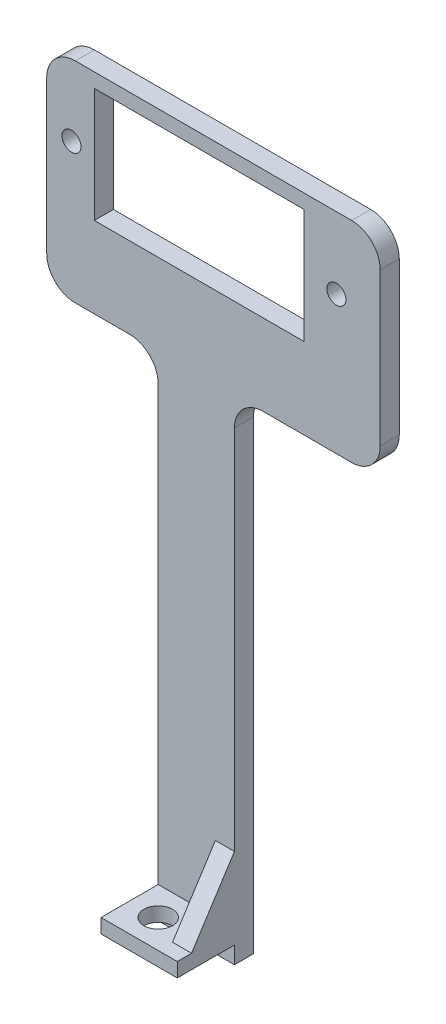
ISO-10303-21;
HEADER;
FILE_DESCRIPTION(('STEP AP214'),'2;1');
FILE_NAME('part.step','',(''),(''),'','','');
FILE_SCHEMA(('AUTOMOTIVE_DESIGN { 1 0 10303 214 1 1 1 1 }'));
ENDSEC;
DATA;
#1=APPLICATION_CONTEXT('core data for automotive mechanical design processes');
#2=APPLICATION_PROTOCOL_DEFINITION('international standard','automotive_design',2000,#1);
#3=PRODUCT_CONTEXT('',#1,'mechanical');
#4=PRODUCT('Part','Part','',(#3));
#5=PRODUCT_RELATED_PRODUCT_CATEGORY('part','',(#4));
#6=PRODUCT_DEFINITION_FORMATION('','',#4);
#7=PRODUCT_DEFINITION_CONTEXT('part definition',#1,'design');
#8=PRODUCT_DEFINITION('design','',#6,#7);
#9=PRODUCT_DEFINITION_SHAPE('','',#8);
#10=(LENGTH_UNIT() NAMED_UNIT(*) SI_UNIT(.MILLI.,.METRE.));
#11=(NAMED_UNIT(*) PLANE_ANGLE_UNIT() SI_UNIT($,.RADIAN.));
#12=(NAMED_UNIT(*) SI_UNIT($,.STERADIAN.) SOLID_ANGLE_UNIT());
#13=UNCERTAINTY_MEASURE_WITH_UNIT(LENGTH_MEASURE(1.E-05),#10,'distance_accuracy_value','');
#14=(GEOMETRIC_REPRESENTATION_CONTEXT(3) GLOBAL_UNCERTAINTY_ASSIGNED_CONTEXT((#13)) GLOBAL_UNIT_ASSIGNED_CONTEXT((#10,
#11,#12)) REPRESENTATION_CONTEXT('',''));
#15=CARTESIAN_POINT('',(0.,0.,0.));
#16=DIRECTION('',(0.,0.,1.));
#17=DIRECTION('',(1.,0.,0.));
#18=AXIS2_PLACEMENT_3D('',#15,#16,#17);
#19=CARTESIAN_POINT('',(0.,1.5,0.));
#20=DIRECTION('',(0.,-1.,0.));
#21=DIRECTION('',(0.,0.,-1.));
#22=AXIS2_PLACEMENT_3D('',#19,#20,#21);
#23=PLANE('',#22);
#24=DIRECTION('',(0.,0.,-1.));
#25=VECTOR('',#24,1.);
#26=CARTESIAN_POINT('',(5.,1.5,-3.));
#27=LINE('',#26,#25);
#28=CARTESIAN_POINT('',(5.,1.5,3.));
#29=VERTEX_POINT('',#28);
#30=CARTESIAN_POINT('',(5.,1.5,1.5));
#31=VERTEX_POINT('',#30);
#32=EDGE_CURVE('E303',#29,#31,#27,.T.);
#33=ORIENTED_EDGE('',*,*,#32,.T.);
#34=DIRECTION('',(1.,0.,0.));
#35=VECTOR('',#34,1.);
#36=CARTESIAN_POINT('',(0.,1.5,1.5));
#37=LINE('',#36,#35);
#38=CARTESIAN_POINT('',(3.,1.5,1.5));
#39=VERTEX_POINT('',#38);
#40=EDGE_CURVE('E235',#31,#39,#37,.F.);
#41=ORIENTED_EDGE('',*,*,#40,.T.);
#42=DIRECTION('',(0.,0.,1.));
#43=VECTOR('',#42,1.);
#44=CARTESIAN_POINT('',(3.,1.5,0.));
#45=LINE('',#44,#43);
#46=CARTESIAN_POINT('',(3.,1.5,-3.));
#47=VERTEX_POINT('',#46);
#48=EDGE_CURVE('E231',#47,#39,#45,.T.);
#49=ORIENTED_EDGE('',*,*,#48,.F.);
#50=DIRECTION('',(-1.,0.,0.));
#51=VECTOR('',#50,1.);
#52=CARTESIAN_POINT('',(5.,1.5,-3.));
#53=LINE('',#52,#51);
#54=CARTESIAN_POINT('',(-3.,1.5,-3.));
#55=VERTEX_POINT('',#54);
#56=EDGE_CURVE('E305',#47,#55,#53,.T.);
#57=ORIENTED_EDGE('',*,*,#56,.T.);
#58=DIRECTION('',(0.,0.,1.));
#59=VECTOR('',#58,1.);
#60=CARTESIAN_POINT('',(-3.,1.5,-3.));
#61=LINE('',#60,#59);
#62=CARTESIAN_POINT('',(-3.,1.5,3.));
#63=VERTEX_POINT('',#62);
#64=EDGE_CURVE('E298',#55,#63,#61,.T.);
#65=ORIENTED_EDGE('',*,*,#64,.T.);
#66=DIRECTION('',(1.,0.,0.));
#67=VECTOR('',#66,1.);
#68=CARTESIAN_POINT('',(5.,1.5,3.));
#69=LINE('',#68,#67);
#70=EDGE_CURVE('E301',#63,#29,#69,.T.);
#71=ORIENTED_EDGE('',*,*,#70,.T.);
#72=EDGE_LOOP('',(#33,#41,#49,#57,#65,#71));
#73=FACE_BOUND('',#72,.T.);
#74=CARTESIAN_POINT('',(0.,1.5,0.));
#75=DIRECTION('',(0.,1.,0.));
#76=DIRECTION('',(0.,0.,1.));
#77=AXIS2_PLACEMENT_3D('',#74,#75,#76);
#78=CIRCLE('',#77,1.5);
#79=CARTESIAN_POINT('',(0.,1.5,1.5));
#80=VERTEX_POINT('',#79);
#81=EDGE_CURVE('E292',#80,#80,#78,.T.);
#82=ORIENTED_EDGE('',*,*,#81,.F.);
#83=EDGE_LOOP('',(#82));
#84=FACE_BOUND('',#83,.T.);
#85=ADVANCED_FACE('F35',(#73,#84),#23,.F.);
#86=CARTESIAN_POINT('',(0.,0.,0.));
#87=DIRECTION('',(0.,-1.,0.));
#88=DIRECTION('',(0.,0.,-1.));
#89=AXIS2_PLACEMENT_3D('',#86,#87,#88);
#90=PLANE('',#89);
#91=DIRECTION('',(-1.,0.,0.));
#92=VECTOR('',#91,1.);
#93=CARTESIAN_POINT('',(5.,0.,-3.));
#94=LINE('',#93,#92);
#95=CARTESIAN_POINT('',(5.,0.,-3.));
#96=VERTEX_POINT('',#95);
#97=CARTESIAN_POINT('',(-3.,0.,-3.));
#98=VERTEX_POINT('',#97);
#99=EDGE_CURVE('E52',#96,#98,#94,.T.);
#100=ORIENTED_EDGE('',*,*,#99,.F.);
#101=DIRECTION('',(0.,0.,-1.));
#102=VECTOR('',#101,1.);
#103=CARTESIAN_POINT('',(5.,0.,-3.));
#104=LINE('',#103,#102);
#105=CARTESIAN_POINT('',(5.,0.,3.));
#106=VERTEX_POINT('',#105);
#107=EDGE_CURVE('E221',#106,#96,#104,.T.);
#108=ORIENTED_EDGE('',*,*,#107,.F.);
#109=DIRECTION('',(1.,0.,0.));
#110=VECTOR('',#109,1.);
#111=CARTESIAN_POINT('',(5.,0.,3.));
#112=LINE('',#111,#110);
#113=CARTESIAN_POINT('',(-3.,0.,3.));
#114=VERTEX_POINT('',#113);
#115=EDGE_CURVE('E309',#114,#106,#112,.T.);
#116=ORIENTED_EDGE('',*,*,#115,.F.);
#117=DIRECTION('',(0.,0.,1.));
#118=VECTOR('',#117,1.);
#119=CARTESIAN_POINT('',(-3.,0.,-3.));
#120=LINE('',#119,#118);
#121=EDGE_CURVE('E295',#98,#114,#120,.T.);
#122=ORIENTED_EDGE('',*,*,#121,.F.);
#123=EDGE_LOOP('',(#100,#108,#116,#122));
#124=FACE_BOUND('',#123,.T.);
#125=CARTESIAN_POINT('',(0.,0.,0.));
#126=DIRECTION('',(0.,1.,0.));
#127=DIRECTION('',(0.,0.,1.));
#128=AXIS2_PLACEMENT_3D('',#125,#126,#127);
#129=CIRCLE('',#128,1.5);
#130=CARTESIAN_POINT('',(0.,0.,1.5));
#131=VERTEX_POINT('',#130);
#132=EDGE_CURVE('E289',#131,#131,#129,.T.);
#133=ORIENTED_EDGE('',*,*,#132,.T.);
#134=EDGE_LOOP('',(#133));
#135=FACE_BOUND('',#134,.T.);
#136=ADVANCED_FACE('F476',(#124,#135),#90,.T.);
#137=CARTESIAN_POINT('',(-3.,1.5,-3.));
#138=DIRECTION('',(1.,0.,0.));
#139=DIRECTION('',(0.,0.,-1.));
#140=AXIS2_PLACEMENT_3D('',#137,#138,#139);
#141=PLANE('',#140);
#142=DIRECTION('',(0.,1.,0.));
#143=VECTOR('',#142,1.);
#144=CARTESIAN_POINT('',(-3.,0.,-3.));
#145=LINE('',#144,#143);
#146=CARTESIAN_POINT('',(-3.,47.,-3.));
#147=VERTEX_POINT('',#146);
#148=EDGE_CURVE('E282',#55,#147,#145,.T.);
#149=ORIENTED_EDGE('',*,*,#148,.T.);
#150=DIRECTION('',(0.,0.,1.));
#151=VECTOR('',#150,1.);
#152=CARTESIAN_POINT('',(-3.,47.,-5.));
#153=LINE('',#152,#151);
#154=CARTESIAN_POINT('',(-3.,47.,-5.));
#155=VERTEX_POINT('',#154);
#156=EDGE_CURVE('E378',#147,#155,#153,.F.);
#157=ORIENTED_EDGE('',*,*,#156,.T.);
#158=DIRECTION('',(0.,1.,0.));
#159=VECTOR('',#158,1.);
#160=CARTESIAN_POINT('',(-3.,0.,-5.));
#161=LINE('',#160,#159);
#162=CARTESIAN_POINT('',(-3.,-1.8,-5.00000000000002));
#163=VERTEX_POINT('',#162);
#164=EDGE_CURVE('E283',#163,#155,#161,.T.);
#165=ORIENTED_EDGE('',*,*,#164,.F.);
#166=DIRECTION('',(0.,0.,-1.));
#167=VECTOR('',#166,1.);
#168=CARTESIAN_POINT('',(-3.,-1.8,-5.00000000000002));
#169=LINE('',#168,#167);
#170=CARTESIAN_POINT('',(-3.,-1.8,-3.));
#171=VERTEX_POINT('',#170);
#172=EDGE_CURVE('E208',#171,#163,#169,.T.);
#173=ORIENTED_EDGE('',*,*,#172,.F.);
#174=DIRECTION('',(0.,1.,0.));
#175=VECTOR('',#174,1.);
#176=CARTESIAN_POINT('',(-3.,-1.8,-3.));
#177=LINE('',#176,#175);
#178=EDGE_CURVE('E204',#171,#98,#177,.T.);
#179=ORIENTED_EDGE('',*,*,#178,.T.);
#180=ORIENTED_EDGE('',*,*,#121,.T.);
#181=DIRECTION('',(0.,-1.,0.));
#182=VECTOR('',#181,1.);
#183=CARTESIAN_POINT('',(-3.,1.5,3.));
#184=LINE('',#183,#182);
#185=EDGE_CURVE('E313',#63,#114,#184,.T.);
#186=ORIENTED_EDGE('',*,*,#185,.F.);
#187=ORIENTED_EDGE('',*,*,#64,.F.);
#188=EDGE_LOOP('',(#149,#157,#165,#173,#179,#180,#186,#187));
#189=FACE_BOUND('',#188,.T.);
#190=ADVANCED_FACE('F400',(#189),#141,.F.);
#191=CARTESIAN_POINT('',(5.,1.5,3.));
#192=DIRECTION('',(0.,0.,-1.));
#193=DIRECTION('',(-1.,0.,0.));
#194=AXIS2_PLACEMENT_3D('',#191,#192,#193);
#195=PLANE('',#194);
#196=ORIENTED_EDGE('',*,*,#115,.T.);
#197=DIRECTION('',(0.,-1.,0.));
#198=VECTOR('',#197,1.);
#199=CARTESIAN_POINT('',(5.,1.5,3.));
#200=LINE('',#199,#198);
#201=EDGE_CURVE('E307',#29,#106,#200,.T.);
#202=ORIENTED_EDGE('',*,*,#201,.F.);
#203=ORIENTED_EDGE('',*,*,#70,.F.);
#204=ORIENTED_EDGE('',*,*,#185,.T.);
#205=EDGE_LOOP('',(#196,#202,#203,#204));
#206=FACE_BOUND('',#205,.T.);
#207=ADVANCED_FACE('F475',(#206),#195,.F.);
#208=CARTESIAN_POINT('',(5.,1.5,-3.));
#209=DIRECTION('',(-1.,0.,0.));
#210=DIRECTION('',(0.,0.,1.));
#211=AXIS2_PLACEMENT_3D('',#208,#209,#210);
#212=PLANE('',#211);
#213=DIRECTION('',(0.,-1.,0.));
#214=VECTOR('',#213,1.);
#215=CARTESIAN_POINT('',(5.,0.,-5.));
#216=LINE('',#215,#214);
#217=CARTESIAN_POINT('',(5.,47.,-5.));
#218=VERTEX_POINT('',#217);
#219=CARTESIAN_POINT('',(5.00000000000001,-1.8,-5.00000000000002));
#220=VERTEX_POINT('',#219);
#221=EDGE_CURVE('E286',#218,#220,#216,.T.);
#222=ORIENTED_EDGE('',*,*,#221,.F.);
#223=DIRECTION('',(0.,0.,-1.));
#224=VECTOR('',#223,1.);
#225=CARTESIAN_POINT('',(5.,47.,-3.));
#226=LINE('',#225,#224);
#227=CARTESIAN_POINT('',(5.,47.,-3.));
#228=VERTEX_POINT('',#227);
#229=EDGE_CURVE('E360',#218,#228,#226,.F.);
#230=ORIENTED_EDGE('',*,*,#229,.T.);
#231=DIRECTION('',(0.,-1.,0.));
#232=VECTOR('',#231,1.);
#233=CARTESIAN_POINT('',(5.,0.,-3.));
#234=LINE('',#233,#232);
#235=CARTESIAN_POINT('',(5.,8.5,-3.));
#236=VERTEX_POINT('',#235);
#237=EDGE_CURVE('E287',#228,#236,#234,.T.);
#238=ORIENTED_EDGE('',*,*,#237,.T.);
#239=DIRECTION('',(0.,0.841178475376553,-0.540757591313499));
#240=VECTOR('',#239,1.);
#241=CARTESIAN_POINT('',(5.,1.5,1.5));
#242=LINE('',#241,#240);
#243=EDGE_CURVE('E225',#31,#236,#242,.T.);
#244=ORIENTED_EDGE('',*,*,#243,.F.);
#245=ORIENTED_EDGE('',*,*,#32,.F.);
#246=ORIENTED_EDGE('',*,*,#201,.T.);
#247=ORIENTED_EDGE('',*,*,#107,.T.);
#248=DIRECTION('',(0.,1.,0.));
#249=VECTOR('',#248,1.);
#250=CARTESIAN_POINT('',(5.,-1.8,-3.));
#251=LINE('',#250,#249);
#252=CARTESIAN_POINT('',(5.,-1.8,-3.));
#253=VERTEX_POINT('',#252);
#254=EDGE_CURVE('E202',#253,#96,#251,.T.);
#255=ORIENTED_EDGE('',*,*,#254,.F.);
#256=DIRECTION('',(0.,0.,1.));
#257=VECTOR('',#256,1.);
#258=CARTESIAN_POINT('',(5.00000000000001,-1.8,-5.00000000000002));
#259=LINE('',#258,#257);
#260=EDGE_CURVE('E209',#220,#253,#259,.T.);
#261=ORIENTED_EDGE('',*,*,#260,.F.);
#262=EDGE_LOOP('',(#222,#230,#238,#244,#245,#246,#247,#255,#261));
#263=FACE_BOUND('',#262,.T.);
#264=ADVANCED_FACE('F219',(#263),#212,.F.);
#265=CARTESIAN_POINT('',(0.,1.5,0.));
#266=DIRECTION('',(0.,-1.,0.));
#267=DIRECTION('',(0.,0.,-1.));
#268=AXIS2_PLACEMENT_3D('',#265,#266,#267);
#269=CYLINDRICAL_SURFACE('',#268,1.5);
#270=ORIENTED_EDGE('',*,*,#81,.T.);
#271=EDGE_LOOP('',(#270));
#272=FACE_BOUND('',#271,.T.);
#273=ORIENTED_EDGE('',*,*,#132,.F.);
#274=EDGE_LOOP('',(#273));
#275=FACE_BOUND('',#274,.T.);
#276=ADVANCED_FACE('F482',(#272,#275),#269,.F.);
#277=CARTESIAN_POINT('',(0.,0.,-5.));
#278=DIRECTION('',(0.,0.,-1.));
#279=DIRECTION('',(-1.,0.,0.));
#280=AXIS2_PLACEMENT_3D('',#277,#278,#279);
#281=PLANE('',#280);
#282=CARTESIAN_POINT('',(15.7,64.5,-5.));
#283=DIRECTION('',(0.,0.,-1.));
#284=DIRECTION('',(-1.,0.,0.));
#285=AXIS2_PLACEMENT_3D('',#282,#283,#284);
#286=CIRCLE('',#285,1.);
#287=CARTESIAN_POINT('',(14.7,64.5,-5.));
#288=VERTEX_POINT('',#287);
#289=EDGE_CURVE('E386',#288,#288,#286,.T.);
#290=ORIENTED_EDGE('',*,*,#289,.F.);
#291=EDGE_LOOP('',(#290));
#292=FACE_BOUND('',#291,.T.);
#293=CARTESIAN_POINT('',(-12.1,64.5,-5.));
#294=DIRECTION('',(0.,0.,-1.));
#295=DIRECTION('',(-1.,0.,0.));
#296=AXIS2_PLACEMENT_3D('',#293,#294,#295);
#297=CIRCLE('',#296,1.);
#298=CARTESIAN_POINT('',(-13.1,64.5,-5.));
#299=VERTEX_POINT('',#298);
#300=EDGE_CURVE('E391',#299,#299,#297,.T.);
#301=ORIENTED_EDGE('',*,*,#300,.F.);
#302=EDGE_LOOP('',(#301));
#303=FACE_BOUND('',#302,.T.);
#304=DIRECTION('',(0.,-1.,0.));
#305=VECTOR('',#304,1.);
#306=CARTESIAN_POINT('',(20.3,72.,-5.));
#307=LINE('',#306,#305);
#308=CARTESIAN_POINT('',(20.3,69.,-5.));
#309=VERTEX_POINT('',#308);
#310=CARTESIAN_POINT('',(20.3,53.,-5.));
#311=VERTEX_POINT('',#310);
#312=EDGE_CURVE('E276',#309,#311,#307,.T.);
#313=ORIENTED_EDGE('',*,*,#312,.T.);
#314=CARTESIAN_POINT('',(17.3,53.,-5.));
#315=DIRECTION('',(0.,0.,-1.));
#316=DIRECTION('',(-1.,0.,0.));
#317=AXIS2_PLACEMENT_3D('',#314,#315,#316);
#318=CIRCLE('',#317,3.);
#319=CARTESIAN_POINT('',(17.3,50.,-5.));
#320=VERTEX_POINT('',#319);
#321=EDGE_CURVE('E345',#311,#320,#318,.T.);
#322=ORIENTED_EDGE('',*,*,#321,.T.);
#323=DIRECTION('',(1.,0.,0.));
#324=VECTOR('',#323,1.);
#325=CARTESIAN_POINT('',(-14.7,50.,-5.));
#326=LINE('',#325,#324);
#327=CARTESIAN_POINT('',(8.,50.,-5.));
#328=VERTEX_POINT('',#327);
#329=EDGE_CURVE('E268',#328,#320,#326,.T.);
#330=ORIENTED_EDGE('',*,*,#329,.F.);
#331=CARTESIAN_POINT('',(8.,47.,-5.));
#332=DIRECTION('',(0.,0.,-1.));
#333=DIRECTION('',(-1.,0.,0.));
#334=AXIS2_PLACEMENT_3D('',#331,#332,#333);
#335=CIRCLE('',#334,3.);
#336=EDGE_CURVE('E380',#328,#218,#335,.F.);
#337=ORIENTED_EDGE('',*,*,#336,.T.);
#338=ORIENTED_EDGE('',*,*,#221,.T.);
#339=DIRECTION('',(1.,0.,0.));
#340=VECTOR('',#339,1.);
#341=CARTESIAN_POINT('',(5.00000000000001,-1.8,-5.00000000000002));
#342=LINE('',#341,#340);
#343=EDGE_CURVE('E215',#163,#220,#342,.T.);
#344=ORIENTED_EDGE('',*,*,#343,.F.);
#345=ORIENTED_EDGE('',*,*,#164,.T.);
#346=CARTESIAN_POINT('',(-6.,47.,-5.));
#347=DIRECTION('',(0.,0.,-1.));
#348=DIRECTION('',(-1.,0.,0.));
#349=AXIS2_PLACEMENT_3D('',#346,#347,#348);
#350=CIRCLE('',#349,3.);
#351=CARTESIAN_POINT('',(-6.,50.,-5.));
#352=VERTEX_POINT('',#351);
#353=EDGE_CURVE('E11',#155,#352,#350,.F.);
#354=ORIENTED_EDGE('',*,*,#353,.T.);
#355=CARTESIAN_POINT('',(-11.7,50.,-5.));
#356=VERTEX_POINT('',#355);
#357=EDGE_CURVE('E262',#356,#352,#326,.T.);
#358=ORIENTED_EDGE('',*,*,#357,.F.);
#359=CARTESIAN_POINT('',(-11.7,53.,-5.));
#360=DIRECTION('',(0.,0.,-1.));
#361=DIRECTION('',(-1.,0.,0.));
#362=AXIS2_PLACEMENT_3D('',#359,#360,#361);
#363=CIRCLE('',#362,3.);
#364=CARTESIAN_POINT('',(-14.7,53.,-5.));
#365=VERTEX_POINT('',#364);
#366=EDGE_CURVE('E339',#356,#365,#363,.T.);
#367=ORIENTED_EDGE('',*,*,#366,.T.);
#368=DIRECTION('',(0.,-1.,0.));
#369=VECTOR('',#368,1.);
#370=CARTESIAN_POINT('',(-14.7,72.,-5.));
#371=LINE('',#370,#369);
#372=CARTESIAN_POINT('',(-14.7,69.,-5.));
#373=VERTEX_POINT('',#372);
#374=EDGE_CURVE('E273',#373,#365,#371,.T.);
#375=ORIENTED_EDGE('',*,*,#374,.F.);
#376=CARTESIAN_POINT('',(-11.7,69.,-5.));
#377=DIRECTION('',(0.,0.,-1.));
#378=DIRECTION('',(-1.,0.,0.));
#379=AXIS2_PLACEMENT_3D('',#376,#377,#378);
#380=CIRCLE('',#379,3.);
#381=CARTESIAN_POINT('',(-11.7,72.,-5.));
#382=VERTEX_POINT('',#381);
#383=EDGE_CURVE('E341',#373,#382,#380,.T.);
#384=ORIENTED_EDGE('',*,*,#383,.T.);
#385=DIRECTION('',(1.,0.,0.));
#386=VECTOR('',#385,1.);
#387=CARTESIAN_POINT('',(-14.7,72.,-5.));
#388=LINE('',#387,#386);
#389=CARTESIAN_POINT('',(17.3,72.,-5.));
#390=VERTEX_POINT('',#389);
#391=EDGE_CURVE('E261',#382,#390,#388,.T.);
#392=ORIENTED_EDGE('',*,*,#391,.T.);
#393=CARTESIAN_POINT('',(17.3,69.,-5.));
#394=DIRECTION('',(0.,0.,-1.));
#395=DIRECTION('',(-1.,0.,0.));
#396=AXIS2_PLACEMENT_3D('',#393,#394,#395);
#397=CIRCLE('',#396,3.);
#398=EDGE_CURVE('E343',#390,#309,#397,.T.);
#399=ORIENTED_EDGE('',*,*,#398,.T.);
#400=EDGE_LOOP('',(#313,#322,#330,#337,#338,#344,#345,#354,#358,#367,#375,#384,#392,#399));
#401=FACE_BOUND('',#400,.T.);
#402=DIRECTION('',(0.,1.,0.));
#403=VECTOR('',#402,1.);
#404=CARTESIAN_POINT('',(-9.7,70.5,-5.));
#405=LINE('',#404,#403);
#406=CARTESIAN_POINT('',(-9.7,58.5,-5.));
#407=VERTEX_POINT('',#406);
#408=CARTESIAN_POINT('',(-9.7,70.5,-5.));
#409=VERTEX_POINT('',#408);
#410=EDGE_CURVE('E237',#407,#409,#405,.T.);
#411=ORIENTED_EDGE('',*,*,#410,.F.);
#412=DIRECTION('',(-1.,0.,0.));
#413=VECTOR('',#412,1.);
#414=CARTESIAN_POINT('',(-9.7,58.5,-5.));
#415=LINE('',#414,#413);
#416=CARTESIAN_POINT('',(12.3,58.5,-5.));
#417=VERTEX_POINT('',#416);
#418=EDGE_CURVE('E245',#417,#407,#415,.T.);
#419=ORIENTED_EDGE('',*,*,#418,.F.);
#420=DIRECTION('',(0.,-1.,0.));
#421=VECTOR('',#420,1.);
#422=CARTESIAN_POINT('',(12.3,70.5,-5.));
#423=LINE('',#422,#421);
#424=CARTESIAN_POINT('',(12.3,70.5,-5.));
#425=VERTEX_POINT('',#424);
#426=EDGE_CURVE('E242',#425,#417,#423,.T.);
#427=ORIENTED_EDGE('',*,*,#426,.F.);
#428=DIRECTION('',(1.,0.,0.));
#429=VECTOR('',#428,1.);
#430=CARTESIAN_POINT('',(-9.7,70.5,-5.));
#431=LINE('',#430,#429);
#432=EDGE_CURVE('E239',#409,#425,#431,.T.);
#433=ORIENTED_EDGE('',*,*,#432,.F.);
#434=EDGE_LOOP('',(#411,#419,#427,#433));
#435=FACE_BOUND('',#434,.T.);
#436=ADVANCED_FACE('F404',(#292,#303,#401,#435),#281,.T.);
#437=CARTESIAN_POINT('',(0.,0.,-3.));
#438=DIRECTION('',(0.,0.,-1.));
#439=DIRECTION('',(-1.,0.,0.));
#440=AXIS2_PLACEMENT_3D('',#437,#438,#439);
#441=PLANE('',#440);
#442=CARTESIAN_POINT('',(15.7,64.5,-3.));
#443=DIRECTION('',(0.,0.,-1.));
#444=DIRECTION('',(-1.,0.,0.));
#445=AXIS2_PLACEMENT_3D('',#442,#443,#444);
#446=CIRCLE('',#445,1.);
#447=CARTESIAN_POINT('',(14.7,64.5,-3.));
#448=VERTEX_POINT('',#447);
#449=EDGE_CURVE('E39',#448,#448,#446,.T.);
#450=ORIENTED_EDGE('',*,*,#449,.T.);
#451=EDGE_LOOP('',(#450));
#452=FACE_BOUND('',#451,.T.);
#453=CARTESIAN_POINT('',(-12.1,64.5,-3.));
#454=DIRECTION('',(0.,0.,-1.));
#455=DIRECTION('',(-1.,0.,0.));
#456=AXIS2_PLACEMENT_3D('',#453,#454,#455);
#457=CIRCLE('',#456,1.);
#458=CARTESIAN_POINT('',(-13.1,64.5,-3.));
#459=VERTEX_POINT('',#458);
#460=EDGE_CURVE('E384',#459,#459,#457,.T.);
#461=ORIENTED_EDGE('',*,*,#460,.T.);
#462=EDGE_LOOP('',(#461));
#463=FACE_BOUND('',#462,.T.);
#464=DIRECTION('',(1.,0.,0.));
#465=VECTOR('',#464,1.);
#466=CARTESIAN_POINT('',(-14.7,50.,-3.));
#467=LINE('',#466,#465);
#468=CARTESIAN_POINT('',(8.,50.,-3.));
#469=VERTEX_POINT('',#468);
#470=CARTESIAN_POINT('',(17.3,50.,-3.));
#471=VERTEX_POINT('',#470);
#472=EDGE_CURVE('E251',#469,#471,#467,.T.);
#473=ORIENTED_EDGE('',*,*,#472,.T.);
#474=CARTESIAN_POINT('',(17.3,53.,-3.));
#475=DIRECTION('',(0.,0.,-1.));
#476=DIRECTION('',(-1.,0.,0.));
#477=AXIS2_PLACEMENT_3D('',#474,#475,#476);
#478=CIRCLE('',#477,3.);
#479=CARTESIAN_POINT('',(20.3,53.,-3.));
#480=VERTEX_POINT('',#479);
#481=EDGE_CURVE('E358',#471,#480,#478,.F.);
#482=ORIENTED_EDGE('',*,*,#481,.T.);
#483=DIRECTION('',(0.,-1.,0.));
#484=VECTOR('',#483,1.);
#485=CARTESIAN_POINT('',(20.3,72.,-3.));
#486=LINE('',#485,#484);
#487=CARTESIAN_POINT('',(20.3,69.,-3.));
#488=VERTEX_POINT('',#487);
#489=EDGE_CURVE('E279',#488,#480,#486,.T.);
#490=ORIENTED_EDGE('',*,*,#489,.F.);
#491=CARTESIAN_POINT('',(17.3,69.,-3.));
#492=DIRECTION('',(0.,0.,-1.));
#493=DIRECTION('',(-1.,0.,0.));
#494=AXIS2_PLACEMENT_3D('',#491,#492,#493);
#495=CIRCLE('',#494,3.);
#496=CARTESIAN_POINT('',(17.3,72.,-3.));
#497=VERTEX_POINT('',#496);
#498=EDGE_CURVE('E356',#488,#497,#495,.F.);
#499=ORIENTED_EDGE('',*,*,#498,.T.);
#500=DIRECTION('',(1.,0.,0.));
#501=VECTOR('',#500,1.);
#502=CARTESIAN_POINT('',(-14.7,72.,-3.));
#503=LINE('',#502,#501);
#504=CARTESIAN_POINT('',(-11.7,72.,-3.));
#505=VERTEX_POINT('',#504);
#506=EDGE_CURVE('E258',#505,#497,#503,.T.);
#507=ORIENTED_EDGE('',*,*,#506,.F.);
#508=CARTESIAN_POINT('',(-11.7,69.,-3.));
#509=DIRECTION('',(0.,0.,-1.));
#510=DIRECTION('',(-1.,0.,0.));
#511=AXIS2_PLACEMENT_3D('',#508,#509,#510);
#512=CIRCLE('',#511,3.);
#513=CARTESIAN_POINT('',(-14.7,69.,-3.));
#514=VERTEX_POINT('',#513);
#515=EDGE_CURVE('E354',#505,#514,#512,.F.);
#516=ORIENTED_EDGE('',*,*,#515,.T.);
#517=DIRECTION('',(0.,-1.,0.));
#518=VECTOR('',#517,1.);
#519=CARTESIAN_POINT('',(-14.7,72.,-3.));
#520=LINE('',#519,#518);
#521=CARTESIAN_POINT('',(-14.7,53.,-3.));
#522=VERTEX_POINT('',#521);
#523=EDGE_CURVE('E265',#514,#522,#520,.T.);
#524=ORIENTED_EDGE('',*,*,#523,.T.);
#525=CARTESIAN_POINT('',(-11.7,53.,-3.));
#526=DIRECTION('',(0.,0.,-1.));
#527=DIRECTION('',(-1.,0.,0.));
#528=AXIS2_PLACEMENT_3D('',#525,#526,#527);
#529=CIRCLE('',#528,3.);
#530=CARTESIAN_POINT('',(-11.7,50.,-3.));
#531=VERTEX_POINT('',#530);
#532=EDGE_CURVE('E352',#522,#531,#529,.F.);
#533=ORIENTED_EDGE('',*,*,#532,.T.);
#534=CARTESIAN_POINT('',(-6.,50.,-3.));
#535=VERTEX_POINT('',#534);
#536=EDGE_CURVE('E266',#531,#535,#467,.T.);
#537=ORIENTED_EDGE('',*,*,#536,.T.);
#538=CARTESIAN_POINT('',(-6.,47.,-3.));
#539=DIRECTION('',(0.,0.,-1.));
#540=DIRECTION('',(-1.,0.,0.));
#541=AXIS2_PLACEMENT_3D('',#538,#539,#540);
#542=CIRCLE('',#541,3.);
#543=EDGE_CURVE('E44',#535,#147,#542,.T.);
#544=ORIENTED_EDGE('',*,*,#543,.T.);
#545=ORIENTED_EDGE('',*,*,#148,.F.);
#546=ORIENTED_EDGE('',*,*,#56,.F.);
#547=DIRECTION('',(0.,-1.,0.));
#548=VECTOR('',#547,1.);
#549=CARTESIAN_POINT('',(3.,0.,-3.));
#550=LINE('',#549,#548);
#551=CARTESIAN_POINT('',(3.,8.5,-3.));
#552=VERTEX_POINT('',#551);
#553=EDGE_CURVE('E328',#552,#47,#550,.T.);
#554=ORIENTED_EDGE('',*,*,#553,.F.);
#555=DIRECTION('',(-1.,0.,0.));
#556=VECTOR('',#555,1.);
#557=CARTESIAN_POINT('',(0.,8.5,-3.));
#558=LINE('',#557,#556);
#559=EDGE_CURVE('E331',#552,#236,#558,.F.);
#560=ORIENTED_EDGE('',*,*,#559,.T.);
#561=ORIENTED_EDGE('',*,*,#237,.F.);
#562=CARTESIAN_POINT('',(8.,47.,-3.));
#563=DIRECTION('',(0.,0.,-1.));
#564=DIRECTION('',(-1.,0.,0.));
#565=AXIS2_PLACEMENT_3D('',#562,#563,#564);
#566=CIRCLE('',#565,3.);
#567=EDGE_CURVE('E382',#228,#469,#566,.T.);
#568=ORIENTED_EDGE('',*,*,#567,.T.);
#569=EDGE_LOOP('',(#473,#482,#490,#499,#507,#516,#524,#533,#537,#544,#545,#546,#554,#560,#561,#568));
#570=FACE_BOUND('',#569,.T.);
#571=DIRECTION('',(-1.,0.,0.));
#572=VECTOR('',#571,1.);
#573=CARTESIAN_POINT('',(-14.7,58.5,-3.));
#574=LINE('',#573,#572);
#575=CARTESIAN_POINT('',(12.3,58.5,-3.));
#576=VERTEX_POINT('',#575);
#577=CARTESIAN_POINT('',(-9.7,58.5,-3.));
#578=VERTEX_POINT('',#577);
#579=EDGE_CURVE('E322',#576,#578,#574,.T.);
#580=ORIENTED_EDGE('',*,*,#579,.T.);
#581=DIRECTION('',(0.,1.,0.));
#582=VECTOR('',#581,1.);
#583=CARTESIAN_POINT('',(-9.7,72.,-3.));
#584=LINE('',#583,#582);
#585=CARTESIAN_POINT('',(-9.7,70.5,-3.));
#586=VERTEX_POINT('',#585);
#587=EDGE_CURVE('E325',#578,#586,#584,.T.);
#588=ORIENTED_EDGE('',*,*,#587,.T.);
#589=DIRECTION('',(1.,0.,0.));
#590=VECTOR('',#589,1.);
#591=CARTESIAN_POINT('',(-14.7,70.5,-3.));
#592=LINE('',#591,#590);
#593=CARTESIAN_POINT('',(12.3,70.5,-3.));
#594=VERTEX_POINT('',#593);
#595=EDGE_CURVE('E316',#586,#594,#592,.T.);
#596=ORIENTED_EDGE('',*,*,#595,.T.);
#597=DIRECTION('',(0.,-1.,0.));
#598=VECTOR('',#597,1.);
#599=CARTESIAN_POINT('',(12.3,72.,-3.));
#600=LINE('',#599,#598);
#601=EDGE_CURVE('E319',#594,#576,#600,.T.);
#602=ORIENTED_EDGE('',*,*,#601,.T.);
#603=EDGE_LOOP('',(#580,#588,#596,#602));
#604=FACE_BOUND('',#603,.T.);
#605=ADVANCED_FACE('F416',(#452,#463,#570,#604),#441,.F.);
#606=CARTESIAN_POINT('',(0.,50.,0.));
#607=DIRECTION('',(0.,1.,0.));
#608=DIRECTION('',(0.,0.,1.));
#609=AXIS2_PLACEMENT_3D('',#606,#607,#608);
#610=PLANE('',#609);
#611=ORIENTED_EDGE('',*,*,#536,.F.);
#612=DIRECTION('',(0.,0.,-1.));
#613=VECTOR('',#612,1.);
#614=CARTESIAN_POINT('',(-11.7,50.,-5.));
#615=LINE('',#614,#613);
#616=EDGE_CURVE('E375',#531,#356,#615,.T.);
#617=ORIENTED_EDGE('',*,*,#616,.T.);
#618=ORIENTED_EDGE('',*,*,#357,.T.);
#619=DIRECTION('',(0.,0.,1.));
#620=VECTOR('',#619,1.);
#621=CARTESIAN_POINT('',(-6.,50.,-3.));
#622=LINE('',#621,#620);
#623=EDGE_CURVE('E372',#352,#535,#622,.T.);
#624=ORIENTED_EDGE('',*,*,#623,.T.);
#625=EDGE_LOOP('',(#611,#617,#618,#624));
#626=FACE_BOUND('',#625,.T.);
#627=ADVANCED_FACE('F454',(#626),#610,.F.);
#628=ORIENTED_EDGE('',*,*,#329,.T.);
#629=DIRECTION('',(0.,0.,-1.));
#630=VECTOR('',#629,1.);
#631=CARTESIAN_POINT('',(17.3,50.,0.));
#632=LINE('',#631,#630);
#633=EDGE_CURVE('E350',#320,#471,#632,.F.);
#634=ORIENTED_EDGE('',*,*,#633,.T.);
#635=ORIENTED_EDGE('',*,*,#472,.F.);
#636=DIRECTION('',(0.,0.,-1.));
#637=VECTOR('',#636,1.);
#638=CARTESIAN_POINT('',(8.,50.,-5.));
#639=LINE('',#638,#637);
#640=EDGE_CURVE('E347',#469,#328,#639,.T.);
#641=ORIENTED_EDGE('',*,*,#640,.T.);
#642=EDGE_LOOP('',(#628,#634,#635,#641));
#643=FACE_BOUND('',#642,.T.);
#644=ADVANCED_FACE('F420',(#643),#610,.F.);
#645=CARTESIAN_POINT('',(20.3,72.,-3.));
#646=DIRECTION('',(-1.,0.,0.));
#647=DIRECTION('',(0.,0.,1.));
#648=AXIS2_PLACEMENT_3D('',#645,#646,#647);
#649=PLANE('',#648);
#650=ORIENTED_EDGE('',*,*,#489,.T.);
#651=DIRECTION('',(0.,0.,-1.));
#652=VECTOR('',#651,1.);
#653=CARTESIAN_POINT('',(20.3,53.,-3.));
#654=LINE('',#653,#652);
#655=EDGE_CURVE('E336',#480,#311,#654,.T.);
#656=ORIENTED_EDGE('',*,*,#655,.T.);
#657=ORIENTED_EDGE('',*,*,#312,.F.);
#658=DIRECTION('',(0.,0.,-1.));
#659=VECTOR('',#658,1.);
#660=CARTESIAN_POINT('',(20.3,69.,-3.));
#661=LINE('',#660,#659);
#662=EDGE_CURVE('E334',#309,#488,#661,.F.);
#663=ORIENTED_EDGE('',*,*,#662,.T.);
#664=EDGE_LOOP('',(#650,#656,#657,#663));
#665=FACE_BOUND('',#664,.T.);
#666=ADVANCED_FACE('F428',(#665),#649,.F.);
#667=CARTESIAN_POINT('',(-14.7,72.,-3.));
#668=DIRECTION('',(-1.,0.,0.));
#669=DIRECTION('',(0.,0.,1.));
#670=AXIS2_PLACEMENT_3D('',#667,#668,#669);
#671=PLANE('',#670);
#672=ORIENTED_EDGE('',*,*,#523,.F.);
#673=DIRECTION('',(0.,0.,-1.));
#674=VECTOR('',#673,1.);
#675=CARTESIAN_POINT('',(-14.7,69.,-3.));
#676=LINE('',#675,#674);
#677=EDGE_CURVE('E369',#514,#373,#676,.T.);
#678=ORIENTED_EDGE('',*,*,#677,.T.);
#679=ORIENTED_EDGE('',*,*,#374,.T.);
#680=DIRECTION('',(0.,0.,-1.));
#681=VECTOR('',#680,1.);
#682=CARTESIAN_POINT('',(-14.7,53.,-3.));
#683=LINE('',#682,#681);
#684=EDGE_CURVE('E367',#365,#522,#683,.F.);
#685=ORIENTED_EDGE('',*,*,#684,.T.);
#686=EDGE_LOOP('',(#672,#678,#679,#685));
#687=FACE_BOUND('',#686,.T.);
#688=ADVANCED_FACE('F446',(#687),#671,.T.);
#689=CARTESIAN_POINT('',(0.,72.,0.));
#690=DIRECTION('',(0.,1.,0.));
#691=DIRECTION('',(0.,0.,1.));
#692=AXIS2_PLACEMENT_3D('',#689,#690,#691);
#693=PLANE('',#692);
#694=ORIENTED_EDGE('',*,*,#506,.T.);
#695=DIRECTION('',(0.,0.,-1.));
#696=VECTOR('',#695,1.);
#697=CARTESIAN_POINT('',(17.3,72.,-5.));
#698=LINE('',#697,#696);
#699=EDGE_CURVE('E364',#497,#390,#698,.T.);
#700=ORIENTED_EDGE('',*,*,#699,.T.);
#701=ORIENTED_EDGE('',*,*,#391,.F.);
#702=DIRECTION('',(0.,0.,-1.));
#703=VECTOR('',#702,1.);
#704=CARTESIAN_POINT('',(-11.7,72.,0.));
#705=LINE('',#704,#703);
#706=EDGE_CURVE('E362',#382,#505,#705,.F.);
#707=ORIENTED_EDGE('',*,*,#706,.T.);
#708=EDGE_LOOP('',(#694,#700,#701,#707));
#709=FACE_BOUND('',#708,.T.);
#710=ADVANCED_FACE('F437',(#709),#693,.T.);
#711=CARTESIAN_POINT('',(-9.7,70.5,5.));
#712=DIRECTION('',(-1.,0.,0.));
#713=DIRECTION('',(0.,-1.,0.));
#714=AXIS2_PLACEMENT_3D('',#711,#712,#713);
#715=PLANE('',#714);
#716=DIRECTION('',(0.,0.,-1.));
#717=VECTOR('',#716,1.);
#718=CARTESIAN_POINT('',(-9.7,58.5,5.));
#719=LINE('',#718,#717);
#720=EDGE_CURVE('E249',#578,#407,#719,.T.);
#721=ORIENTED_EDGE('',*,*,#720,.T.);
#722=ORIENTED_EDGE('',*,*,#410,.T.);
#723=DIRECTION('',(0.,0.,-1.));
#724=VECTOR('',#723,1.);
#725=CARTESIAN_POINT('',(-9.7,70.5,5.));
#726=LINE('',#725,#724);
#727=EDGE_CURVE('E248',#586,#409,#726,.T.);
#728=ORIENTED_EDGE('',*,*,#727,.F.);
#729=ORIENTED_EDGE('',*,*,#587,.F.);
#730=EDGE_LOOP('',(#721,#722,#728,#729));
#731=FACE_BOUND('',#730,.T.);
#732=ADVANCED_FACE('F534',(#731),#715,.F.);
#733=CARTESIAN_POINT('',(-9.7,58.5,5.));
#734=DIRECTION('',(0.,-1.,0.));
#735=DIRECTION('',(0.,0.,-1.));
#736=AXIS2_PLACEMENT_3D('',#733,#734,#735);
#737=PLANE('',#736);
#738=DIRECTION('',(0.,0.,-1.));
#739=VECTOR('',#738,1.);
#740=CARTESIAN_POINT('',(12.3,58.5,5.));
#741=LINE('',#740,#739);
#742=EDGE_CURVE('E252',#576,#417,#741,.T.);
#743=ORIENTED_EDGE('',*,*,#742,.T.);
#744=ORIENTED_EDGE('',*,*,#418,.T.);
#745=ORIENTED_EDGE('',*,*,#720,.F.);
#746=ORIENTED_EDGE('',*,*,#579,.F.);
#747=EDGE_LOOP('',(#743,#744,#745,#746));
#748=FACE_BOUND('',#747,.T.);
#749=ADVANCED_FACE('F530',(#748),#737,.F.);
#750=CARTESIAN_POINT('',(12.3,70.5,5.));
#751=DIRECTION('',(1.,0.,0.));
#752=DIRECTION('',(0.,1.,0.));
#753=AXIS2_PLACEMENT_3D('',#750,#751,#752);
#754=PLANE('',#753);
#755=DIRECTION('',(0.,0.,-1.));
#756=VECTOR('',#755,1.);
#757=CARTESIAN_POINT('',(12.3,70.5,5.));
#758=LINE('',#757,#756);
#759=EDGE_CURVE('E254',#594,#425,#758,.T.);
#760=ORIENTED_EDGE('',*,*,#759,.T.);
#761=ORIENTED_EDGE('',*,*,#426,.T.);
#762=ORIENTED_EDGE('',*,*,#742,.F.);
#763=ORIENTED_EDGE('',*,*,#601,.F.);
#764=EDGE_LOOP('',(#760,#761,#762,#763));
#765=FACE_BOUND('',#764,.T.);
#766=ADVANCED_FACE('F533',(#765),#754,.F.);
#767=CARTESIAN_POINT('',(-9.7,70.5,5.));
#768=DIRECTION('',(0.,1.,0.));
#769=DIRECTION('',(0.,0.,1.));
#770=AXIS2_PLACEMENT_3D('',#767,#768,#769);
#771=PLANE('',#770);
#772=ORIENTED_EDGE('',*,*,#727,.T.);
#773=ORIENTED_EDGE('',*,*,#432,.T.);
#774=ORIENTED_EDGE('',*,*,#759,.F.);
#775=ORIENTED_EDGE('',*,*,#595,.F.);
#776=EDGE_LOOP('',(#772,#773,#774,#775));
#777=FACE_BOUND('',#776,.T.);
#778=ADVANCED_FACE('F529',(#777),#771,.F.);
#779=CARTESIAN_POINT('',(5.,1.5,1.5));
#780=DIRECTION('',(0.,-0.540757591313499,-0.841178475376554));
#781=DIRECTION('',(0.,0.841178475376553,-0.540757591313499));
#782=AXIS2_PLACEMENT_3D('',#779,#780,#781);
#783=PLANE('',#782);
#784=ORIENTED_EDGE('',*,*,#40,.F.);
#785=ORIENTED_EDGE('',*,*,#243,.T.);
#786=ORIENTED_EDGE('',*,*,#559,.F.);
#787=DIRECTION('',(0.,0.841178475376553,-0.540757591313499));
#788=VECTOR('',#787,1.);
#789=CARTESIAN_POINT('',(3.,1.5,1.5));
#790=LINE('',#789,#788);
#791=EDGE_CURVE('E222',#39,#552,#790,.T.);
#792=ORIENTED_EDGE('',*,*,#791,.F.);
#793=EDGE_LOOP('',(#784,#785,#786,#792));
#794=FACE_BOUND('',#793,.T.);
#795=ADVANCED_FACE('F470',(#794),#783,.F.);
#796=CARTESIAN_POINT('',(3.,36.,-1.));
#797=DIRECTION('',(1.,0.,0.));
#798=DIRECTION('',(0.,0.,-1.));
#799=AXIS2_PLACEMENT_3D('',#796,#797,#798);
#800=PLANE('',#799);
#801=ORIENTED_EDGE('',*,*,#553,.T.);
#802=ORIENTED_EDGE('',*,*,#48,.T.);
#803=ORIENTED_EDGE('',*,*,#791,.T.);
#804=EDGE_LOOP('',(#801,#802,#803));
#805=FACE_BOUND('',#804,.T.);
#806=ADVANCED_FACE('F468',(#805),#800,.F.);
#807=CARTESIAN_POINT('',(17.3,53.,-3.));
#808=DIRECTION('',(0.,0.,-1.));
#809=DIRECTION('',(-1.,0.,0.));
#810=AXIS2_PLACEMENT_3D('',#807,#808,#809);
#811=CYLINDRICAL_SURFACE('',#810,3.);
#812=ORIENTED_EDGE('',*,*,#481,.F.);
#813=ORIENTED_EDGE('',*,*,#633,.F.);
#814=ORIENTED_EDGE('',*,*,#321,.F.);
#815=ORIENTED_EDGE('',*,*,#655,.F.);
#816=EDGE_LOOP('',(#812,#813,#814,#815));
#817=FACE_BOUND('',#816,.T.);
#818=ADVANCED_FACE('F423',(#817),#811,.T.);
#819=CARTESIAN_POINT('',(8.,47.,0.));
#820=DIRECTION('',(0.,0.,1.));
#821=DIRECTION('',(1.,0.,0.));
#822=AXIS2_PLACEMENT_3D('',#819,#820,#821);
#823=CYLINDRICAL_SURFACE('',#822,3.);
#824=ORIENTED_EDGE('',*,*,#567,.F.);
#825=ORIENTED_EDGE('',*,*,#229,.F.);
#826=ORIENTED_EDGE('',*,*,#336,.F.);
#827=ORIENTED_EDGE('',*,*,#640,.F.);
#828=EDGE_LOOP('',(#824,#825,#826,#827));
#829=FACE_BOUND('',#828,.T.);
#830=ADVANCED_FACE('F412',(#829),#823,.F.);
#831=CARTESIAN_POINT('',(17.3,69.,0.));
#832=DIRECTION('',(0.,0.,1.));
#833=DIRECTION('',(1.,0.,0.));
#834=AXIS2_PLACEMENT_3D('',#831,#832,#833);
#835=CYLINDRICAL_SURFACE('',#834,3.);
#836=ORIENTED_EDGE('',*,*,#498,.F.);
#837=ORIENTED_EDGE('',*,*,#662,.F.);
#838=ORIENTED_EDGE('',*,*,#398,.F.);
#839=ORIENTED_EDGE('',*,*,#699,.F.);
#840=EDGE_LOOP('',(#836,#837,#838,#839));
#841=FACE_BOUND('',#840,.T.);
#842=ADVANCED_FACE('F432',(#841),#835,.T.);
#843=CARTESIAN_POINT('',(-11.7,69.,-3.));
#844=DIRECTION('',(0.,0.,-1.));
#845=DIRECTION('',(-1.,0.,0.));
#846=AXIS2_PLACEMENT_3D('',#843,#844,#845);
#847=CYLINDRICAL_SURFACE('',#846,3.);
#848=ORIENTED_EDGE('',*,*,#515,.F.);
#849=ORIENTED_EDGE('',*,*,#706,.F.);
#850=ORIENTED_EDGE('',*,*,#383,.F.);
#851=ORIENTED_EDGE('',*,*,#677,.F.);
#852=EDGE_LOOP('',(#848,#849,#850,#851));
#853=FACE_BOUND('',#852,.T.);
#854=ADVANCED_FACE('F441',(#853),#847,.T.);
#855=CARTESIAN_POINT('',(-11.7,53.,0.));
#856=DIRECTION('',(0.,0.,1.));
#857=DIRECTION('',(1.,0.,0.));
#858=AXIS2_PLACEMENT_3D('',#855,#856,#857);
#859=CYLINDRICAL_SURFACE('',#858,3.);
#860=ORIENTED_EDGE('',*,*,#532,.F.);
#861=ORIENTED_EDGE('',*,*,#684,.F.);
#862=ORIENTED_EDGE('',*,*,#366,.F.);
#863=ORIENTED_EDGE('',*,*,#616,.F.);
#864=EDGE_LOOP('',(#860,#861,#862,#863));
#865=FACE_BOUND('',#864,.T.);
#866=ADVANCED_FACE('F450',(#865),#859,.T.);
#867=CARTESIAN_POINT('',(-6.,47.,0.));
#868=DIRECTION('',(0.,0.,-1.));
#869=DIRECTION('',(-1.,0.,0.));
#870=AXIS2_PLACEMENT_3D('',#867,#868,#869);
#871=CYLINDRICAL_SURFACE('',#870,3.);
#872=ORIENTED_EDGE('',*,*,#353,.F.);
#873=ORIENTED_EDGE('',*,*,#156,.F.);
#874=ORIENTED_EDGE('',*,*,#543,.F.);
#875=ORIENTED_EDGE('',*,*,#623,.F.);
#876=EDGE_LOOP('',(#872,#873,#874,#875));
#877=FACE_BOUND('',#876,.T.);
#878=ADVANCED_FACE('F37',(#877),#871,.F.);
#879=CARTESIAN_POINT('',(5.,-1.8,-3.));
#880=DIRECTION('',(0.,0.,-1.));
#881=DIRECTION('',(-1.,0.,0.));
#882=AXIS2_PLACEMENT_3D('',#879,#880,#881);
#883=PLANE('',#882);
#884=ORIENTED_EDGE('',*,*,#99,.T.);
#885=ORIENTED_EDGE('',*,*,#178,.F.);
#886=DIRECTION('',(-1.,0.,0.));
#887=VECTOR('',#886,1.);
#888=CARTESIAN_POINT('',(5.,-1.8,-3.));
#889=LINE('',#888,#887);
#890=EDGE_CURVE('E198',#253,#171,#889,.T.);
#891=ORIENTED_EDGE('',*,*,#890,.F.);
#892=ORIENTED_EDGE('',*,*,#254,.T.);
#893=EDGE_LOOP('',(#884,#885,#891,#892));
#894=FACE_BOUND('',#893,.T.);
#895=ADVANCED_FACE('F200',(#894),#883,.F.);
#896=CARTESIAN_POINT('',(0.,-1.8,0.));
#897=DIRECTION('',(0.,-1.,0.));
#898=DIRECTION('',(0.,0.,-1.));
#899=AXIS2_PLACEMENT_3D('',#896,#897,#898);
#900=PLANE('',#899);
#901=ORIENTED_EDGE('',*,*,#260,.T.);
#902=ORIENTED_EDGE('',*,*,#890,.T.);
#903=ORIENTED_EDGE('',*,*,#172,.T.);
#904=ORIENTED_EDGE('',*,*,#343,.T.);
#905=EDGE_LOOP('',(#901,#902,#903,#904));
#906=FACE_BOUND('',#905,.T.);
#907=ADVANCED_FACE('F213',(#906),#900,.T.);
#908=CARTESIAN_POINT('',(-12.1,64.5,5.));
#909=DIRECTION('',(0.,0.,-1.));
#910=DIRECTION('',(-1.,0.,0.));
#911=AXIS2_PLACEMENT_3D('',#908,#909,#910);
#912=CYLINDRICAL_SURFACE('',#911,1.);
#913=ORIENTED_EDGE('',*,*,#300,.T.);
#914=EDGE_LOOP('',(#913));
#915=FACE_BOUND('',#914,.T.);
#916=ORIENTED_EDGE('',*,*,#460,.F.);
#917=EDGE_LOOP('',(#916));
#918=FACE_BOUND('',#917,.T.);
#919=ADVANCED_FACE('F521',(#915,#918),#912,.F.);
#920=CARTESIAN_POINT('',(15.7,64.5,5.));
#921=DIRECTION('',(0.,0.,-1.));
#922=DIRECTION('',(-1.,0.,0.));
#923=AXIS2_PLACEMENT_3D('',#920,#921,#922);
#924=CYLINDRICAL_SURFACE('',#923,1.);
#925=ORIENTED_EDGE('',*,*,#289,.T.);
#926=EDGE_LOOP('',(#925));
#927=FACE_BOUND('',#926,.T.);
#928=ORIENTED_EDGE('',*,*,#449,.F.);
#929=EDGE_LOOP('',(#928));
#930=FACE_BOUND('',#929,.T.);
#931=ADVANCED_FACE('F558',(#927,#930),#924,.F.);
#932=CLOSED_SHELL('',(#85,#136,#190,#207,#264,#276,#436,#605,#627,#644,#666,#688,#710,#732,#749,
#766,#778,#795,#806,#818,#830,#842,#854,#866,#878,#895,#907,#919,#931));
#933=MANIFOLD_SOLID_BREP('B2',#932);
#934=ADVANCED_BREP_SHAPE_REPRESENTATION('',(#18,#933),#14);
#935=SHAPE_DEFINITION_REPRESENTATION(#9,#934);
ENDSEC;
END-ISO-10303-21;
